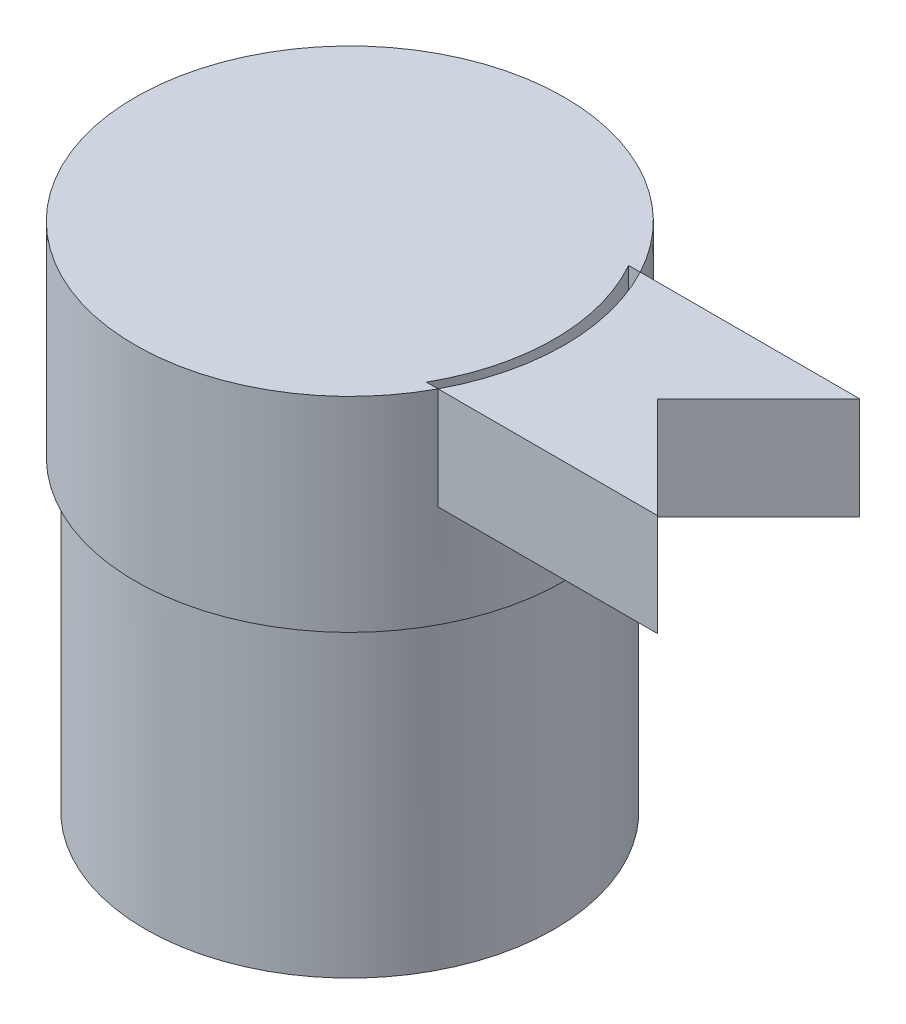
ISO-10303-21;
HEADER;
FILE_DESCRIPTION(('STEP AP214'),'2;1');
FILE_NAME('part.step','',(''),(''),'','','');
FILE_SCHEMA(('AUTOMOTIVE_DESIGN { 1 0 10303 214 1 1 1 1 }'));
ENDSEC;
DATA;
#1=APPLICATION_CONTEXT('core data for automotive mechanical design processes');
#2=APPLICATION_PROTOCOL_DEFINITION('international standard','automotive_design',2000,#1);
#3=PRODUCT_CONTEXT('',#1,'mechanical');
#4=PRODUCT('Part','Part','',(#3));
#5=PRODUCT_RELATED_PRODUCT_CATEGORY('part','',(#4));
#6=PRODUCT_DEFINITION_FORMATION('','',#4);
#7=PRODUCT_DEFINITION_CONTEXT('part definition',#1,'design');
#8=PRODUCT_DEFINITION('design','',#6,#7);
#9=PRODUCT_DEFINITION_SHAPE('','',#8);
#10=(LENGTH_UNIT() NAMED_UNIT(*) SI_UNIT(.MILLI.,.METRE.));
#11=(NAMED_UNIT(*) PLANE_ANGLE_UNIT() SI_UNIT($,.RADIAN.));
#12=(NAMED_UNIT(*) SI_UNIT($,.STERADIAN.) SOLID_ANGLE_UNIT());
#13=UNCERTAINTY_MEASURE_WITH_UNIT(LENGTH_MEASURE(1.E-05),#10,'distance_accuracy_value','');
#14=(GEOMETRIC_REPRESENTATION_CONTEXT(3) GLOBAL_UNCERTAINTY_ASSIGNED_CONTEXT((#13)) GLOBAL_UNIT_ASSIGNED_CONTEXT((#10,
#11,#12)) REPRESENTATION_CONTEXT('',''));
#15=CARTESIAN_POINT('',(0.,0.,0.));
#16=DIRECTION('',(0.,0.,1.));
#17=DIRECTION('',(1.,0.,0.));
#18=AXIS2_PLACEMENT_3D('',#15,#16,#17);
#19=CARTESIAN_POINT('',(0.,250.,0.));
#20=DIRECTION('',(0.,-1.,0.));
#21=DIRECTION('',(0.,0.,-1.));
#22=AXIS2_PLACEMENT_3D('',#19,#20,#21);
#23=CYLINDRICAL_SURFACE('',#22,105.);
#24=CARTESIAN_POINT('',(0.,200.,0.));
#25=DIRECTION('',(0.,1.,0.));
#26=DIRECTION('',(0.,0.,1.));
#27=AXIS2_PLACEMENT_3D('',#24,#25,#26);
#28=CIRCLE('',#27,105.);
#29=CARTESIAN_POINT('',(92.6216704476473,200.,49.4593384861485));
#30=VERTEX_POINT('',#29);
#31=CARTESIAN_POINT('',(92.6216704476474,200.,-49.4593384861484));
#32=VERTEX_POINT('',#31);
#33=EDGE_CURVE('E149',#30,#32,#28,.T.);
#34=ORIENTED_EDGE('',*,*,#33,.F.);
#35=DIRECTION('',(0.,-1.,0.));
#36=VECTOR('',#35,1.);
#37=CARTESIAN_POINT('',(92.6216704476473,250.,49.4593384861485));
#38=LINE('',#37,#36);
#39=CARTESIAN_POINT('',(92.6216704476473,250.,49.4593384861485));
#40=VERTEX_POINT('',#39);
#41=EDGE_CURVE('E13',#40,#30,#38,.T.);
#42=ORIENTED_EDGE('',*,*,#41,.F.);
#43=CARTESIAN_POINT('',(0.,250.,0.));
#44=DIRECTION('',(0.,1.,0.));
#45=DIRECTION('',(0.,0.,1.));
#46=AXIS2_PLACEMENT_3D('',#43,#44,#45);
#47=CIRCLE('',#46,105.);
#48=CARTESIAN_POINT('',(92.6216704476474,250.,-49.4593384861484));
#49=VERTEX_POINT('',#48);
#50=EDGE_CURVE('E160',#40,#49,#47,.T.);
#51=ORIENTED_EDGE('',*,*,#50,.T.);
#52=DIRECTION('',(0.,-1.,0.));
#53=VECTOR('',#52,1.);
#54=CARTESIAN_POINT('',(92.6216704476474,250.,-49.4593384861484));
#55=LINE('',#54,#53);
#56=EDGE_CURVE('E92',#49,#32,#55,.T.);
#57=ORIENTED_EDGE('',*,*,#56,.T.);
#58=EDGE_LOOP('',(#34,#42,#51,#57));
#59=FACE_BOUND('',#58,.T.);
#60=ADVANCED_FACE('F76',(#59),#23,.F.);
#61=CARTESIAN_POINT('',(0.,250.,49.4593384861485));
#62=DIRECTION('',(0.,0.,-1.));
#63=DIRECTION('',(-1.,0.,0.));
#64=AXIS2_PLACEMENT_3D('',#61,#62,#63);
#65=PLANE('',#64);
#66=DIRECTION('',(1.,0.,0.));
#67=VECTOR('',#66,1.);
#68=CARTESIAN_POINT('',(0.,200.,49.4593384861485));
#69=LINE('',#68,#67);
#70=CARTESIAN_POINT('',(200.,200.,49.4593384861485));
#71=VERTEX_POINT('',#70);
#72=EDGE_CURVE('E151',#30,#71,#69,.T.);
#73=ORIENTED_EDGE('',*,*,#72,.T.);
#74=DIRECTION('',(0.,-1.,0.));
#75=VECTOR('',#74,1.);
#76=CARTESIAN_POINT('',(200.,250.,49.4593384861485));
#77=LINE('',#76,#75);
#78=CARTESIAN_POINT('',(200.,250.,49.4593384861485));
#79=VERTEX_POINT('',#78);
#80=EDGE_CURVE('E84',#79,#71,#77,.T.);
#81=ORIENTED_EDGE('',*,*,#80,.F.);
#82=DIRECTION('',(1.,0.,0.));
#83=VECTOR('',#82,1.);
#84=CARTESIAN_POINT('',(0.,250.,49.4593384861485));
#85=LINE('',#84,#83);
#86=EDGE_CURVE('E140',#40,#79,#85,.T.);
#87=ORIENTED_EDGE('',*,*,#86,.F.);
#88=ORIENTED_EDGE('',*,*,#41,.T.);
#89=EDGE_LOOP('',(#73,#81,#87,#88));
#90=FACE_BOUND('',#89,.T.);
#91=ADVANCED_FACE('F164',(#90),#65,.F.);
#92=CARTESIAN_POINT('',(75.2703307569257,250.,-75.2703307569257));
#93=DIRECTION('',(0.707106781186547,0.,-0.707106781186548));
#94=DIRECTION('',(-0.707106781186548,0.,-0.707106781186547));
#95=AXIS2_PLACEMENT_3D('',#92,#93,#94);
#96=PLANE('',#95);
#97=DIRECTION('',(0.707106781186548,0.,0.707106781186547));
#98=VECTOR('',#97,1.);
#99=CARTESIAN_POINT('',(75.2703307569257,200.,-75.2703307569257));
#100=LINE('',#99,#98);
#101=CARTESIAN_POINT('',(150.540661513851,200.,-1.80411241501588E-13));
#102=VERTEX_POINT('',#101);
#103=EDGE_CURVE('E129',#102,#71,#100,.T.);
#104=ORIENTED_EDGE('',*,*,#103,.F.);
#105=DIRECTION('',(0.,-1.,0.));
#106=VECTOR('',#105,1.);
#107=CARTESIAN_POINT('',(150.540661513851,250.,-1.80411241501588E-13));
#108=LINE('',#107,#106);
#109=CARTESIAN_POINT('',(150.540661513851,250.,-1.80411241501588E-13));
#110=VERTEX_POINT('',#109);
#111=EDGE_CURVE('E124',#110,#102,#108,.T.);
#112=ORIENTED_EDGE('',*,*,#111,.F.);
#113=DIRECTION('',(0.707106781186548,0.,0.707106781186547));
#114=VECTOR('',#113,1.);
#115=CARTESIAN_POINT('',(75.2703307569257,250.,-75.2703307569257));
#116=LINE('',#115,#114);
#117=EDGE_CURVE('E127',#110,#79,#116,.T.);
#118=ORIENTED_EDGE('',*,*,#117,.T.);
#119=ORIENTED_EDGE('',*,*,#80,.T.);
#120=EDGE_LOOP('',(#104,#112,#118,#119));
#121=FACE_BOUND('',#120,.T.);
#122=ADVANCED_FACE('F126',(#121),#96,.T.);
#123=CARTESIAN_POINT('',(75.2703307569249,250.,75.2703307569256));
#124=DIRECTION('',(0.707106781186545,0.,0.70710678118655));
#125=DIRECTION('',(0.70710678118655,0.,-0.707106781186545));
#126=AXIS2_PLACEMENT_3D('',#123,#124,#125);
#127=PLANE('',#126);
#128=DIRECTION('',(-0.70710678118655,0.,0.707106781186545));
#129=VECTOR('',#128,1.);
#130=CARTESIAN_POINT('',(75.2703307569249,200.,75.2703307569256));
#131=LINE('',#130,#129);
#132=CARTESIAN_POINT('',(200.,200.,-49.4593384861484));
#133=VERTEX_POINT('',#132);
#134=EDGE_CURVE('E155',#133,#102,#131,.T.);
#135=ORIENTED_EDGE('',*,*,#134,.F.);
#136=DIRECTION('',(0.,-1.,0.));
#137=VECTOR('',#136,1.);
#138=CARTESIAN_POINT('',(200.,250.,-49.4593384861484));
#139=LINE('',#138,#137);
#140=CARTESIAN_POINT('',(200.,250.,-49.4593384861484));
#141=VERTEX_POINT('',#140);
#142=EDGE_CURVE('E108',#141,#133,#139,.T.);
#143=ORIENTED_EDGE('',*,*,#142,.F.);
#144=DIRECTION('',(-0.70710678118655,0.,0.707106781186545));
#145=VECTOR('',#144,1.);
#146=CARTESIAN_POINT('',(75.2703307569249,250.,75.2703307569256));
#147=LINE('',#146,#145);
#148=EDGE_CURVE('E139',#141,#110,#147,.T.);
#149=ORIENTED_EDGE('',*,*,#148,.T.);
#150=ORIENTED_EDGE('',*,*,#111,.T.);
#151=EDGE_LOOP('',(#135,#143,#149,#150));
#152=FACE_BOUND('',#151,.T.);
#153=ADVANCED_FACE('F143',(#152),#127,.T.);
#154=CARTESIAN_POINT('',(0.,250.,-49.4593384861484));
#155=DIRECTION('',(0.,0.,-1.));
#156=DIRECTION('',(-1.,0.,0.));
#157=AXIS2_PLACEMENT_3D('',#154,#155,#156);
#158=PLANE('',#157);
#159=DIRECTION('',(1.,0.,0.));
#160=VECTOR('',#159,1.);
#161=CARTESIAN_POINT('',(0.,200.,-49.4593384861484));
#162=LINE('',#161,#160);
#163=EDGE_CURVE('E157',#32,#133,#162,.T.);
#164=ORIENTED_EDGE('',*,*,#163,.F.);
#165=ORIENTED_EDGE('',*,*,#56,.F.);
#166=DIRECTION('',(1.,0.,0.));
#167=VECTOR('',#166,1.);
#168=CARTESIAN_POINT('',(0.,250.,-49.4593384861484));
#169=LINE('',#168,#167);
#170=EDGE_CURVE('E144',#49,#141,#169,.T.);
#171=ORIENTED_EDGE('',*,*,#170,.T.);
#172=ORIENTED_EDGE('',*,*,#142,.T.);
#173=EDGE_LOOP('',(#164,#165,#171,#172));
#174=FACE_BOUND('',#173,.T.);
#175=ADVANCED_FACE('F167',(#174),#158,.T.);
#176=CARTESIAN_POINT('',(0.,250.,0.));
#177=DIRECTION('',(0.,1.,0.));
#178=DIRECTION('',(0.,0.,1.));
#179=AXIS2_PLACEMENT_3D('',#176,#177,#178);
#180=PLANE('',#179);
#181=ORIENTED_EDGE('',*,*,#50,.F.);
#182=ORIENTED_EDGE('',*,*,#86,.T.);
#183=ORIENTED_EDGE('',*,*,#117,.F.);
#184=ORIENTED_EDGE('',*,*,#148,.F.);
#185=ORIENTED_EDGE('',*,*,#170,.F.);
#186=EDGE_LOOP('',(#181,#182,#183,#184,#185));
#187=FACE_BOUND('',#186,.T.);
#188=ADVANCED_FACE('F137',(#187),#180,.T.);
#189=CARTESIAN_POINT('',(0.,200.,0.));
#190=DIRECTION('',(0.,1.,0.));
#191=DIRECTION('',(0.,0.,1.));
#192=AXIS2_PLACEMENT_3D('',#189,#190,#191);
#193=PLANE('',#192);
#194=ORIENTED_EDGE('',*,*,#33,.T.);
#195=ORIENTED_EDGE('',*,*,#163,.T.);
#196=ORIENTED_EDGE('',*,*,#134,.T.);
#197=ORIENTED_EDGE('',*,*,#103,.T.);
#198=ORIENTED_EDGE('',*,*,#72,.F.);
#199=EDGE_LOOP('',(#194,#195,#196,#197,#198));
#200=FACE_BOUND('',#199,.T.);
#201=ADVANCED_FACE('F166',(#200),#193,.F.);
#202=CLOSED_SHELL('',(#60,#91,#122,#153,#175,#188,#201));
#203=MANIFOLD_SOLID_BREP('B2',#202);
#204=CARTESIAN_POINT('',(0.,200.,0.));
#205=DIRECTION('',(0.,-1.,0.));
#206=DIRECTION('',(0.,0.,-1.));
#207=AXIS2_PLACEMENT_3D('',#204,#205,#206);
#208=CYLINDRICAL_SURFACE('',#207,100.);
#209=CARTESIAN_POINT('',(0.,150.,0.));
#210=DIRECTION('',(0.,-1.,0.));
#211=DIRECTION('',(0.,0.,-1.));
#212=AXIS2_PLACEMENT_3D('',#209,#210,#211);
#213=CIRCLE('',#212,100.);
#214=CARTESIAN_POINT('',(0.,150.,-100.));
#215=VERTEX_POINT('',#214);
#216=EDGE_CURVE('E229',#215,#215,#213,.T.);
#217=ORIENTED_EDGE('',*,*,#216,.T.);
#218=EDGE_LOOP('',(#217));
#219=FACE_BOUND('',#218,.T.);
#220=CARTESIAN_POINT('',(0.,0.,0.));
#221=DIRECTION('',(0.,1.,0.));
#222=DIRECTION('',(0.,0.,1.));
#223=AXIS2_PLACEMENT_3D('',#220,#221,#222);
#224=CIRCLE('',#223,100.);
#225=CARTESIAN_POINT('',(0.,0.,100.));
#226=VERTEX_POINT('',#225);
#227=EDGE_CURVE('E74',#226,#226,#224,.T.);
#228=ORIENTED_EDGE('',*,*,#227,.T.);
#229=EDGE_LOOP('',(#228));
#230=FACE_BOUND('',#229,.T.);
#231=ADVANCED_FACE('F226',(#219,#230),#208,.T.);
#232=CARTESIAN_POINT('',(0.,0.,0.));
#233=DIRECTION('',(0.,1.,0.));
#234=DIRECTION('',(0.,0.,1.));
#235=AXIS2_PLACEMENT_3D('',#232,#233,#234);
#236=PLANE('',#235);
#237=ORIENTED_EDGE('',*,*,#227,.F.);
#238=EDGE_LOOP('',(#237));
#239=FACE_BOUND('',#238,.T.);
#240=ADVANCED_FACE('F323',(#239),#236,.F.);
#241=CARTESIAN_POINT('',(0.,200.,0.));
#242=DIRECTION('',(0.,-1.,0.));
#243=DIRECTION('',(0.,0.,-1.));
#244=AXIS2_PLACEMENT_3D('',#241,#242,#243);
#245=PLANE('',#244);
#246=CARTESIAN_POINT('',(0.,200.,0.));
#247=DIRECTION('',(0.,-1.,0.));
#248=DIRECTION('',(0.,0.,-1.));
#249=AXIS2_PLACEMENT_3D('',#246,#247,#248);
#250=CIRCLE('',#249,105.);
#251=CARTESIAN_POINT('',(92.6216704476474,200.,-49.4593384861484));
#252=VERTEX_POINT('',#251);
#253=CARTESIAN_POINT('',(92.6216704476473,200.,49.4593384861485));
#254=VERTEX_POINT('',#253);
#255=EDGE_CURVE('E286',#252,#254,#250,.T.);
#256=ORIENTED_EDGE('',*,*,#255,.F.);
#257=DIRECTION('',(1.,0.,0.));
#258=VECTOR('',#257,1.);
#259=CARTESIAN_POINT('',(0.,200.,-49.4593384861484));
#260=LINE('',#259,#258);
#261=CARTESIAN_POINT('',(86.9124492608084,200.,-49.4593384861484));
#262=VERTEX_POINT('',#261);
#263=EDGE_CURVE('E288',#262,#252,#260,.T.);
#264=ORIENTED_EDGE('',*,*,#263,.F.);
#265=CARTESIAN_POINT('',(0.,200.,0.));
#266=DIRECTION('',(0.,-1.,0.));
#267=DIRECTION('',(0.,0.,-1.));
#268=AXIS2_PLACEMENT_3D('',#265,#266,#267);
#269=CIRCLE('',#268,100.);
#270=CARTESIAN_POINT('',(86.9124492608084,200.,49.4593384861485));
#271=VERTEX_POINT('',#270);
#272=EDGE_CURVE('E241',#262,#271,#269,.T.);
#273=ORIENTED_EDGE('',*,*,#272,.T.);
#274=DIRECTION('',(1.,0.,0.));
#275=VECTOR('',#274,1.);
#276=CARTESIAN_POINT('',(0.,200.,49.4593384861485));
#277=LINE('',#276,#275);
#278=EDGE_CURVE('E274',#271,#254,#277,.T.);
#279=ORIENTED_EDGE('',*,*,#278,.T.);
#280=EDGE_LOOP('',(#256,#264,#273,#279));
#281=FACE_BOUND('',#280,.T.);
#282=ADVANCED_FACE('F284',(#281),#245,.F.);
#283=CARTESIAN_POINT('',(0.,150.,0.));
#284=DIRECTION('',(0.,-1.,0.));
#285=DIRECTION('',(0.,0.,-1.));
#286=AXIS2_PLACEMENT_3D('',#283,#284,#285);
#287=PLANE('',#286);
#288=ORIENTED_EDGE('',*,*,#216,.F.);
#289=EDGE_LOOP('',(#288));
#290=FACE_BOUND('',#289,.T.);
#291=CARTESIAN_POINT('',(0.,150.,0.));
#292=DIRECTION('',(0.,-1.,0.));
#293=DIRECTION('',(0.,0.,-1.));
#294=AXIS2_PLACEMENT_3D('',#291,#292,#293);
#295=CIRCLE('',#294,105.);
#296=CARTESIAN_POINT('',(0.,150.,-105.));
#297=VERTEX_POINT('',#296);
#298=EDGE_CURVE('E293',#297,#297,#295,.T.);
#299=ORIENTED_EDGE('',*,*,#298,.T.);
#300=EDGE_LOOP('',(#299));
#301=FACE_BOUND('',#300,.T.);
#302=ADVANCED_FACE('F312',(#290,#301),#287,.T.);
#303=CARTESIAN_POINT('',(0.,250.,0.));
#304=DIRECTION('',(0.,1.,0.));
#305=DIRECTION('',(0.,0.,1.));
#306=AXIS2_PLACEMENT_3D('',#303,#304,#305);
#307=PLANE('',#306);
#308=CARTESIAN_POINT('',(0.,250.,0.));
#309=DIRECTION('',(0.,1.,0.));
#310=DIRECTION('',(0.,0.,1.));
#311=AXIS2_PLACEMENT_3D('',#308,#309,#310);
#312=CIRCLE('',#311,100.);
#313=CARTESIAN_POINT('',(86.9124492608084,250.,49.4593384861485));
#314=VERTEX_POINT('',#313);
#315=CARTESIAN_POINT('',(86.9124492608084,250.,-49.4593384861484));
#316=VERTEX_POINT('',#315);
#317=EDGE_CURVE('E287',#314,#316,#312,.T.);
#318=ORIENTED_EDGE('',*,*,#317,.T.);
#319=DIRECTION('',(1.,0.,0.));
#320=VECTOR('',#319,1.);
#321=CARTESIAN_POINT('',(0.,250.,-49.4593384861484));
#322=LINE('',#321,#320);
#323=CARTESIAN_POINT('',(92.6216704476474,250.,-49.4593384861484));
#324=VERTEX_POINT('',#323);
#325=EDGE_CURVE('E266',#316,#324,#322,.T.);
#326=ORIENTED_EDGE('',*,*,#325,.T.);
#327=CARTESIAN_POINT('',(0.,250.,0.));
#328=DIRECTION('',(0.,1.,0.));
#329=DIRECTION('',(0.,0.,1.));
#330=AXIS2_PLACEMENT_3D('',#327,#328,#329);
#331=CIRCLE('',#330,105.);
#332=CARTESIAN_POINT('',(92.6216704476473,250.,49.4593384861485));
#333=VERTEX_POINT('',#332);
#334=EDGE_CURVE('E301',#324,#333,#331,.T.);
#335=ORIENTED_EDGE('',*,*,#334,.T.);
#336=DIRECTION('',(1.,0.,0.));
#337=VECTOR('',#336,1.);
#338=CARTESIAN_POINT('',(0.,250.,49.4593384861485));
#339=LINE('',#338,#337);
#340=EDGE_CURVE('E276',#314,#333,#339,.T.);
#341=ORIENTED_EDGE('',*,*,#340,.F.);
#342=EDGE_LOOP('',(#318,#326,#335,#341));
#343=FACE_BOUND('',#342,.T.);
#344=ADVANCED_FACE('F310',(#343),#307,.T.);
#345=CARTESIAN_POINT('',(0.,250.,49.4593384861485));
#346=DIRECTION('',(0.,0.,-1.));
#347=DIRECTION('',(-1.,0.,0.));
#348=AXIS2_PLACEMENT_3D('',#345,#346,#347);
#349=PLANE('',#348);
#350=ORIENTED_EDGE('',*,*,#278,.F.);
#351=DIRECTION('',(0.,-1.,0.));
#352=VECTOR('',#351,1.);
#353=CARTESIAN_POINT('',(86.9124492608084,250.,49.4593384861485));
#354=LINE('',#353,#352);
#355=EDGE_CURVE('E249',#314,#271,#354,.T.);
#356=ORIENTED_EDGE('',*,*,#355,.F.);
#357=ORIENTED_EDGE('',*,*,#340,.T.);
#358=DIRECTION('',(0.,-1.,0.));
#359=VECTOR('',#358,1.);
#360=CARTESIAN_POINT('',(92.6216704476473,250.,49.4593384861485));
#361=LINE('',#360,#359);
#362=EDGE_CURVE('E271',#333,#254,#361,.T.);
#363=ORIENTED_EDGE('',*,*,#362,.T.);
#364=EDGE_LOOP('',(#350,#356,#357,#363));
#365=FACE_BOUND('',#364,.T.);
#366=ADVANCED_FACE('F273',(#365),#349,.T.);
#367=CARTESIAN_POINT('',(0.,250.,0.));
#368=DIRECTION('',(0.,-1.,0.));
#369=DIRECTION('',(0.,0.,-1.));
#370=AXIS2_PLACEMENT_3D('',#367,#368,#369);
#371=CYLINDRICAL_SURFACE('',#370,105.);
#372=DIRECTION('',(0.,-1.,0.));
#373=VECTOR('',#372,1.);
#374=CARTESIAN_POINT('',(92.6216704476474,250.,-49.4593384861484));
#375=LINE('',#374,#373);
#376=EDGE_CURVE('E280',#324,#252,#375,.T.);
#377=ORIENTED_EDGE('',*,*,#376,.T.);
#378=ORIENTED_EDGE('',*,*,#255,.T.);
#379=ORIENTED_EDGE('',*,*,#362,.F.);
#380=ORIENTED_EDGE('',*,*,#334,.F.);
#381=EDGE_LOOP('',(#377,#378,#379,#380));
#382=FACE_BOUND('',#381,.T.);
#383=ORIENTED_EDGE('',*,*,#298,.F.);
#384=EDGE_LOOP('',(#383));
#385=FACE_BOUND('',#384,.T.);
#386=ADVANCED_FACE('F291',(#382,#385),#371,.T.);
#387=CARTESIAN_POINT('',(0.,250.,-49.4593384861484));
#388=DIRECTION('',(0.,0.,-1.));
#389=DIRECTION('',(-1.,0.,0.));
#390=AXIS2_PLACEMENT_3D('',#387,#388,#389);
#391=PLANE('',#390);
#392=ORIENTED_EDGE('',*,*,#263,.T.);
#393=ORIENTED_EDGE('',*,*,#376,.F.);
#394=ORIENTED_EDGE('',*,*,#325,.F.);
#395=DIRECTION('',(0.,-1.,0.));
#396=VECTOR('',#395,1.);
#397=CARTESIAN_POINT('',(86.9124492608084,250.,-49.4593384861484));
#398=LINE('',#397,#396);
#399=EDGE_CURVE('E234',#316,#262,#398,.T.);
#400=ORIENTED_EDGE('',*,*,#399,.T.);
#401=EDGE_LOOP('',(#392,#393,#394,#400));
#402=FACE_BOUND('',#401,.T.);
#403=ADVANCED_FACE('F307',(#402),#391,.F.);
#404=ORIENTED_EDGE('',*,*,#272,.F.);
#405=ORIENTED_EDGE('',*,*,#399,.F.);
#406=ORIENTED_EDGE('',*,*,#317,.F.);
#407=ORIENTED_EDGE('',*,*,#355,.T.);
#408=EDGE_LOOP('',(#404,#405,#406,#407));
#409=FACE_BOUND('',#408,.T.);
#410=ADVANCED_FACE('F308',(#409),#208,.T.);
#411=CLOSED_SHELL('',(#231,#240,#282,#302,#344,#366,#386,#403,#410));
#412=MANIFOLD_SOLID_BREP('B7',#411);
#413=ADVANCED_BREP_SHAPE_REPRESENTATION('',(#18,#203,#412),#14);
#414=SHAPE_DEFINITION_REPRESENTATION(#9,#413);
ENDSEC;
END-ISO-10303-21;
